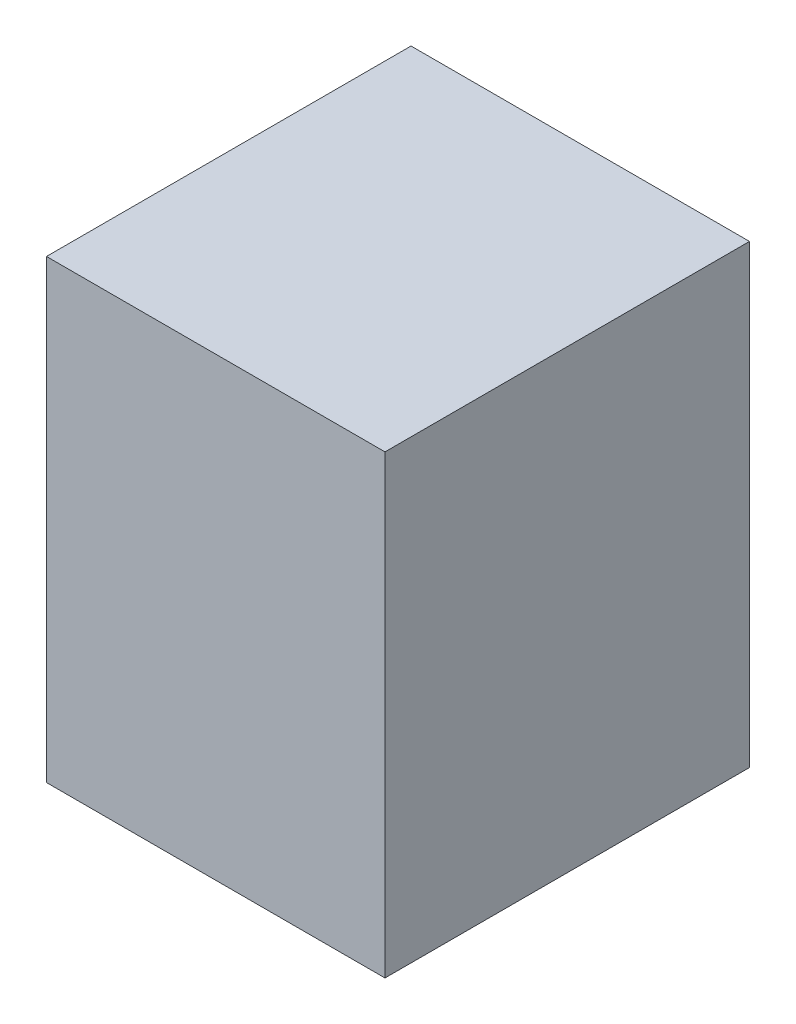
ISO-10303-21;
HEADER;
FILE_DESCRIPTION(('STEP AP214'),'2;1');
FILE_NAME('part.step','',(''),(''),'','','');
FILE_SCHEMA(('AUTOMOTIVE_DESIGN { 1 0 10303 214 1 1 1 1 }'));
ENDSEC;
DATA;
#1=APPLICATION_CONTEXT('core data for automotive mechanical design processes');
#2=APPLICATION_PROTOCOL_DEFINITION('international standard','automotive_design',2000,#1);
#3=PRODUCT_CONTEXT('',#1,'mechanical');
#4=PRODUCT('Part','Part','',(#3));
#5=PRODUCT_RELATED_PRODUCT_CATEGORY('part','',(#4));
#6=PRODUCT_DEFINITION_FORMATION('','',#4);
#7=PRODUCT_DEFINITION_CONTEXT('part definition',#1,'design');
#8=PRODUCT_DEFINITION('design','',#6,#7);
#9=PRODUCT_DEFINITION_SHAPE('','',#8);
#10=(LENGTH_UNIT() NAMED_UNIT(*) SI_UNIT(.MILLI.,.METRE.));
#11=(NAMED_UNIT(*) PLANE_ANGLE_UNIT() SI_UNIT($,.RADIAN.));
#12=(NAMED_UNIT(*) SI_UNIT($,.STERADIAN.) SOLID_ANGLE_UNIT());
#13=UNCERTAINTY_MEASURE_WITH_UNIT(LENGTH_MEASURE(1.E-05),#10,'distance_accuracy_value','');
#14=(GEOMETRIC_REPRESENTATION_CONTEXT(3) GLOBAL_UNCERTAINTY_ASSIGNED_CONTEXT((#13)) GLOBAL_UNIT_ASSIGNED_CONTEXT((#10,
#11,#12)) REPRESENTATION_CONTEXT('',''));
#15=CARTESIAN_POINT('',(0.,0.,0.));
#16=DIRECTION('',(0.,0.,1.));
#17=DIRECTION('',(1.,0.,0.));
#18=AXIS2_PLACEMENT_3D('',#15,#16,#17);
#19=CARTESIAN_POINT('',(165.1,444.5,-177.8));
#20=DIRECTION('',(-1.,0.,0.));
#21=DIRECTION('',(0.,0.,1.));
#22=AXIS2_PLACEMENT_3D('',#19,#20,#21);
#23=PLANE('',#22);
#24=DIRECTION('',(0.,0.,-1.));
#25=VECTOR('',#24,1.);
#26=CARTESIAN_POINT('',(165.1,0.,-177.8));
#27=LINE('',#26,#25);
#28=CARTESIAN_POINT('',(165.1,0.,177.8));
#29=VERTEX_POINT('',#28);
#30=CARTESIAN_POINT('',(165.1,0.,-177.8));
#31=VERTEX_POINT('',#30);
#32=EDGE_CURVE('E96',#29,#31,#27,.T.);
#33=ORIENTED_EDGE('',*,*,#32,.T.);
#34=DIRECTION('',(0.,-1.,0.));
#35=VECTOR('',#34,1.);
#36=CARTESIAN_POINT('',(165.1,444.5,-177.8));
#37=LINE('',#36,#35);
#38=CARTESIAN_POINT('',(165.1,444.5,-177.8));
#39=VERTEX_POINT('',#38);
#40=EDGE_CURVE('E11',#39,#31,#37,.T.);
#41=ORIENTED_EDGE('',*,*,#40,.F.);
#42=DIRECTION('',(0.,0.,-1.));
#43=VECTOR('',#42,1.);
#44=CARTESIAN_POINT('',(165.1,444.5,-177.8));
#45=LINE('',#44,#43);
#46=CARTESIAN_POINT('',(165.1,444.5,177.8));
#47=VERTEX_POINT('',#46);
#48=EDGE_CURVE('E84',#47,#39,#45,.T.);
#49=ORIENTED_EDGE('',*,*,#48,.F.);
#50=DIRECTION('',(0.,-1.,0.));
#51=VECTOR('',#50,1.);
#52=CARTESIAN_POINT('',(165.1,444.5,177.8));
#53=LINE('',#52,#51);
#54=EDGE_CURVE('E92',#47,#29,#53,.T.);
#55=ORIENTED_EDGE('',*,*,#54,.T.);
#56=EDGE_LOOP('',(#33,#41,#49,#55));
#57=FACE_BOUND('',#56,.T.);
#58=ADVANCED_FACE('F33',(#57),#23,.F.);
#59=CARTESIAN_POINT('',(-165.1,444.5,-177.8));
#60=DIRECTION('',(0.,0.,1.));
#61=DIRECTION('',(1.,0.,0.));
#62=AXIS2_PLACEMENT_3D('',#59,#60,#61);
#63=PLANE('',#62);
#64=DIRECTION('',(-1.,0.,0.));
#65=VECTOR('',#64,1.);
#66=CARTESIAN_POINT('',(-165.1,0.,-177.8));
#67=LINE('',#66,#65);
#68=CARTESIAN_POINT('',(-165.1,0.,-177.8));
#69=VERTEX_POINT('',#68);
#70=EDGE_CURVE('E88',#31,#69,#67,.T.);
#71=ORIENTED_EDGE('',*,*,#70,.T.);
#72=DIRECTION('',(0.,-1.,0.));
#73=VECTOR('',#72,1.);
#74=CARTESIAN_POINT('',(-165.1,444.5,-177.8));
#75=LINE('',#74,#73);
#76=CARTESIAN_POINT('',(-165.1,444.5,-177.8));
#77=VERTEX_POINT('',#76);
#78=EDGE_CURVE('E41',#77,#69,#75,.T.);
#79=ORIENTED_EDGE('',*,*,#78,.F.);
#80=DIRECTION('',(-1.,0.,0.));
#81=VECTOR('',#80,1.);
#82=CARTESIAN_POINT('',(-165.1,444.5,-177.8));
#83=LINE('',#82,#81);
#84=EDGE_CURVE('E79',#39,#77,#83,.T.);
#85=ORIENTED_EDGE('',*,*,#84,.F.);
#86=ORIENTED_EDGE('',*,*,#40,.T.);
#87=EDGE_LOOP('',(#71,#79,#85,#86));
#88=FACE_BOUND('',#87,.T.);
#89=ADVANCED_FACE('F87',(#88),#63,.F.);
#90=CARTESIAN_POINT('',(-165.1,444.5,-177.8));
#91=DIRECTION('',(1.,0.,0.));
#92=DIRECTION('',(0.,0.,-1.));
#93=AXIS2_PLACEMENT_3D('',#90,#91,#92);
#94=PLANE('',#93);
#95=DIRECTION('',(0.,0.,1.));
#96=VECTOR('',#95,1.);
#97=CARTESIAN_POINT('',(-165.1,0.,-177.8));
#98=LINE('',#97,#96);
#99=CARTESIAN_POINT('',(-165.1,0.,177.8));
#100=VERTEX_POINT('',#99);
#101=EDGE_CURVE('E66',#69,#100,#98,.T.);
#102=ORIENTED_EDGE('',*,*,#101,.T.);
#103=DIRECTION('',(0.,-1.,0.));
#104=VECTOR('',#103,1.);
#105=CARTESIAN_POINT('',(-165.1,444.5,177.8));
#106=LINE('',#105,#104);
#107=CARTESIAN_POINT('',(-165.1,444.5,177.8));
#108=VERTEX_POINT('',#107);
#109=EDGE_CURVE('E89',#108,#100,#106,.T.);
#110=ORIENTED_EDGE('',*,*,#109,.F.);
#111=DIRECTION('',(0.,0.,1.));
#112=VECTOR('',#111,1.);
#113=CARTESIAN_POINT('',(-165.1,444.5,-177.8));
#114=LINE('',#113,#112);
#115=EDGE_CURVE('E82',#77,#108,#114,.T.);
#116=ORIENTED_EDGE('',*,*,#115,.F.);
#117=ORIENTED_EDGE('',*,*,#78,.T.);
#118=EDGE_LOOP('',(#102,#110,#116,#117));
#119=FACE_BOUND('',#118,.T.);
#120=ADVANCED_FACE('F90',(#119),#94,.F.);
#121=CARTESIAN_POINT('',(-165.1,444.5,177.8));
#122=DIRECTION('',(0.,0.,-1.));
#123=DIRECTION('',(-1.,0.,0.));
#124=AXIS2_PLACEMENT_3D('',#121,#122,#123);
#125=PLANE('',#124);
#126=DIRECTION('',(1.,0.,0.));
#127=VECTOR('',#126,1.);
#128=CARTESIAN_POINT('',(-165.1,0.,177.8));
#129=LINE('',#128,#127);
#130=EDGE_CURVE('E72',#100,#29,#129,.T.);
#131=ORIENTED_EDGE('',*,*,#130,.T.);
#132=ORIENTED_EDGE('',*,*,#54,.F.);
#133=DIRECTION('',(1.,0.,0.));
#134=VECTOR('',#133,1.);
#135=CARTESIAN_POINT('',(-165.1,444.5,177.8));
#136=LINE('',#135,#134);
#137=EDGE_CURVE('E49',#108,#47,#136,.T.);
#138=ORIENTED_EDGE('',*,*,#137,.F.);
#139=ORIENTED_EDGE('',*,*,#109,.T.);
#140=EDGE_LOOP('',(#131,#132,#138,#139));
#141=FACE_BOUND('',#140,.T.);
#142=ADVANCED_FACE('F103',(#141),#125,.F.);
#143=CARTESIAN_POINT('',(0.,444.5,0.));
#144=DIRECTION('',(0.,1.,0.));
#145=DIRECTION('',(0.,0.,1.));
#146=AXIS2_PLACEMENT_3D('',#143,#144,#145);
#147=PLANE('',#146);
#148=ORIENTED_EDGE('',*,*,#48,.T.);
#149=ORIENTED_EDGE('',*,*,#84,.T.);
#150=ORIENTED_EDGE('',*,*,#115,.T.);
#151=ORIENTED_EDGE('',*,*,#137,.T.);
#152=EDGE_LOOP('',(#148,#149,#150,#151));
#153=FACE_BOUND('',#152,.T.);
#154=ADVANCED_FACE('F80',(#153),#147,.T.);
#155=CARTESIAN_POINT('',(0.,0.,0.));
#156=DIRECTION('',(0.,1.,0.));
#157=DIRECTION('',(0.,0.,1.));
#158=AXIS2_PLACEMENT_3D('',#155,#156,#157);
#159=PLANE('',#158);
#160=ORIENTED_EDGE('',*,*,#32,.F.);
#161=ORIENTED_EDGE('',*,*,#130,.F.);
#162=ORIENTED_EDGE('',*,*,#101,.F.);
#163=ORIENTED_EDGE('',*,*,#70,.F.);
#164=EDGE_LOOP('',(#160,#161,#162,#163));
#165=FACE_BOUND('',#164,.T.);
#166=ADVANCED_FACE('F106',(#165),#159,.F.);
#167=CLOSED_SHELL('',(#58,#89,#120,#142,#154,#166));
#168=MANIFOLD_SOLID_BREP('B2',#167);
#169=ADVANCED_BREP_SHAPE_REPRESENTATION('',(#18,#168),#14);
#170=SHAPE_DEFINITION_REPRESENTATION(#9,#169);
ENDSEC;
END-ISO-10303-21;
